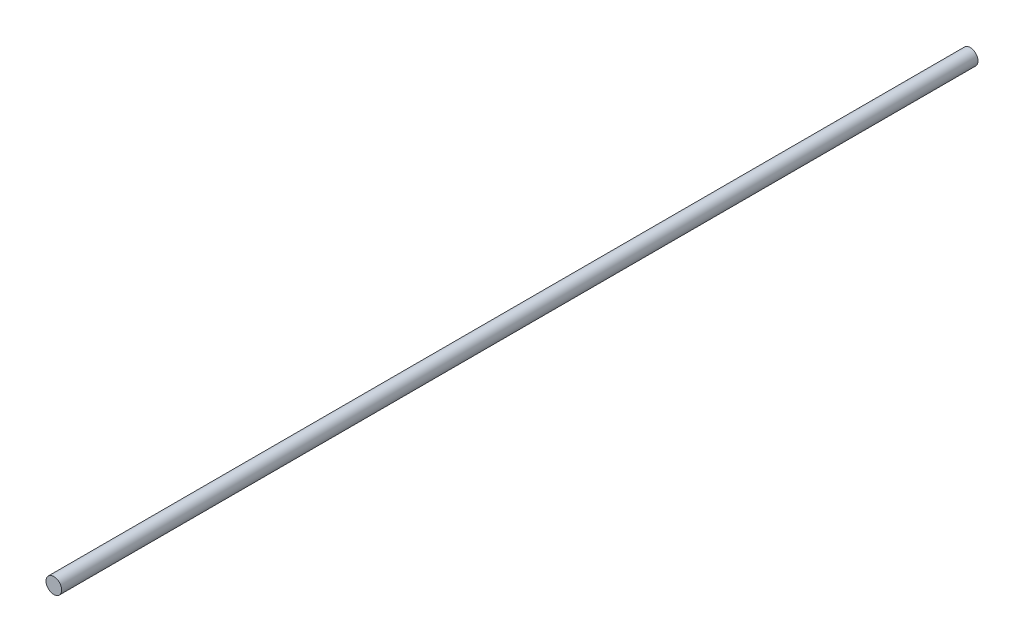
ISO-10303-21;
HEADER;
FILE_DESCRIPTION(('STEP AP214'),'2;1');
FILE_NAME('part.step','',(''),(''),'','','');
FILE_SCHEMA(('AUTOMOTIVE_DESIGN { 1 0 10303 214 1 1 1 1 }'));
ENDSEC;
DATA;
#1=APPLICATION_CONTEXT('core data for automotive mechanical design processes');
#2=APPLICATION_PROTOCOL_DEFINITION('international standard','automotive_design',2000,#1);
#3=PRODUCT_CONTEXT('',#1,'mechanical');
#4=PRODUCT('Part','Part','',(#3));
#5=PRODUCT_RELATED_PRODUCT_CATEGORY('part','',(#4));
#6=PRODUCT_DEFINITION_FORMATION('','',#4);
#7=PRODUCT_DEFINITION_CONTEXT('part definition',#1,'design');
#8=PRODUCT_DEFINITION('design','',#6,#7);
#9=PRODUCT_DEFINITION_SHAPE('','',#8);
#10=(LENGTH_UNIT() NAMED_UNIT(*) SI_UNIT(.MILLI.,.METRE.));
#11=(NAMED_UNIT(*) PLANE_ANGLE_UNIT() SI_UNIT($,.RADIAN.));
#12=(NAMED_UNIT(*) SI_UNIT($,.STERADIAN.) SOLID_ANGLE_UNIT());
#13=UNCERTAINTY_MEASURE_WITH_UNIT(LENGTH_MEASURE(1.E-05),#10,'distance_accuracy_value','');
#14=(GEOMETRIC_REPRESENTATION_CONTEXT(3) GLOBAL_UNCERTAINTY_ASSIGNED_CONTEXT((#13)) GLOBAL_UNIT_ASSIGNED_CONTEXT((#10,
#11,#12)) REPRESENTATION_CONTEXT('',''));
#15=CARTESIAN_POINT('',(0.,0.,0.));
#16=DIRECTION('',(0.,0.,1.));
#17=DIRECTION('',(1.,0.,0.));
#18=AXIS2_PLACEMENT_3D('',#15,#16,#17);
#19=CARTESIAN_POINT('',(0.,0.,558.8));
#20=DIRECTION('',(0.,0.,-1.));
#21=DIRECTION('',(-1.,0.,0.));
#22=AXIS2_PLACEMENT_3D('',#19,#20,#21);
#23=CYLINDRICAL_SURFACE('',#22,4.7625);
#24=CARTESIAN_POINT('',(0.,0.,558.8));
#25=DIRECTION('',(0.,0.,1.));
#26=DIRECTION('',(1.,0.,0.));
#27=AXIS2_PLACEMENT_3D('',#24,#25,#26);
#28=CIRCLE('',#27,4.7625);
#29=CARTESIAN_POINT('',(4.7625,0.,558.8));
#30=VERTEX_POINT('',#29);
#31=EDGE_CURVE('E10',#30,#30,#28,.T.);
#32=ORIENTED_EDGE('',*,*,#31,.F.);
#33=EDGE_LOOP('',(#32));
#34=FACE_BOUND('',#33,.T.);
#35=CARTESIAN_POINT('',(0.,0.,0.));
#36=DIRECTION('',(0.,0.,1.));
#37=DIRECTION('',(1.,0.,0.));
#38=AXIS2_PLACEMENT_3D('',#35,#36,#37);
#39=CIRCLE('',#38,4.7625);
#40=CARTESIAN_POINT('',(4.7625,0.,0.));
#41=VERTEX_POINT('',#40);
#42=EDGE_CURVE('E36',#41,#41,#39,.T.);
#43=ORIENTED_EDGE('',*,*,#42,.T.);
#44=EDGE_LOOP('',(#43));
#45=FACE_BOUND('',#44,.T.);
#46=ADVANCED_FACE('F33',(#34,#45),#23,.T.);
#47=CARTESIAN_POINT('',(0.,0.,558.8));
#48=DIRECTION('',(0.,0.,1.));
#49=DIRECTION('',(1.,0.,0.));
#50=AXIS2_PLACEMENT_3D('',#47,#48,#49);
#51=PLANE('',#50);
#52=ORIENTED_EDGE('',*,*,#31,.T.);
#53=EDGE_LOOP('',(#52));
#54=FACE_BOUND('',#53,.T.);
#55=ADVANCED_FACE('F48',(#54),#51,.T.);
#56=CARTESIAN_POINT('',(0.,0.,0.));
#57=DIRECTION('',(0.,0.,1.));
#58=DIRECTION('',(1.,0.,0.));
#59=AXIS2_PLACEMENT_3D('',#56,#57,#58);
#60=PLANE('',#59);
#61=ORIENTED_EDGE('',*,*,#42,.F.);
#62=EDGE_LOOP('',(#61));
#63=FACE_BOUND('',#62,.T.);
#64=ADVANCED_FACE('F46',(#63),#60,.F.);
#65=CLOSED_SHELL('',(#46,#55,#64));
#66=MANIFOLD_SOLID_BREP('B2',#65);
#67=ADVANCED_BREP_SHAPE_REPRESENTATION('',(#18,#66),#14);
#68=SHAPE_DEFINITION_REPRESENTATION(#9,#67);
ENDSEC;
END-ISO-10303-21;
